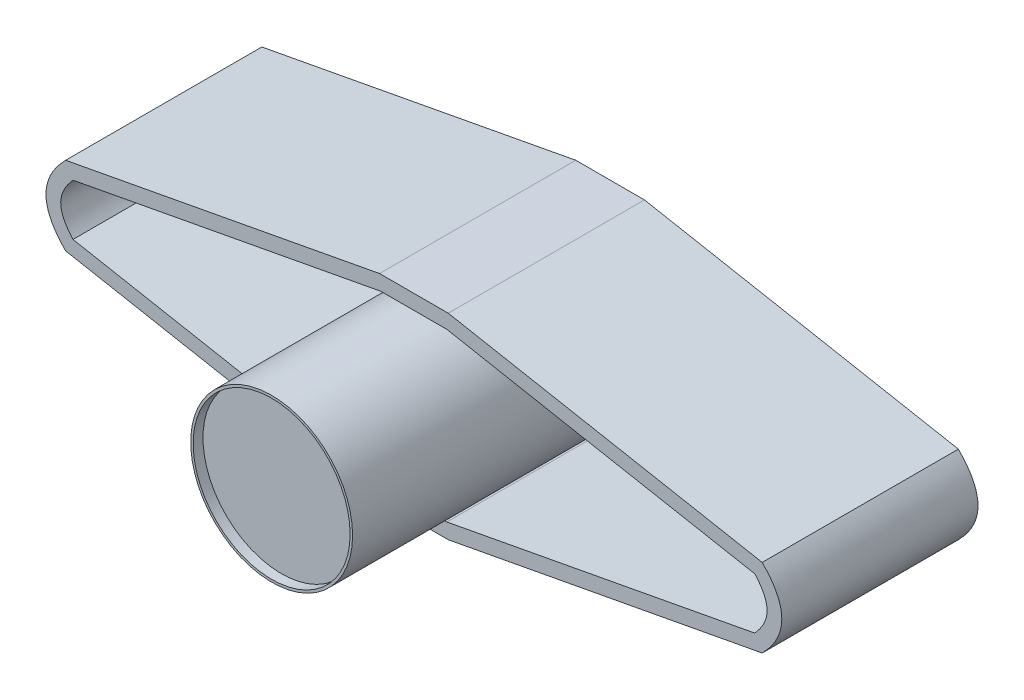
ISO-10303-21;
HEADER;
FILE_DESCRIPTION(('STEP AP214'),'2;1');
FILE_NAME('part.step','',(''),(''),'','','');
FILE_SCHEMA(('AUTOMOTIVE_DESIGN { 1 0 10303 214 1 1 1 1 }'));
ENDSEC;
DATA;
#1=APPLICATION_CONTEXT('core data for automotive mechanical design processes');
#2=APPLICATION_PROTOCOL_DEFINITION('international standard','automotive_design',2000,#1);
#3=PRODUCT_CONTEXT('',#1,'mechanical');
#4=PRODUCT('Part','Part','',(#3));
#5=PRODUCT_RELATED_PRODUCT_CATEGORY('part','',(#4));
#6=PRODUCT_DEFINITION_FORMATION('','',#4);
#7=PRODUCT_DEFINITION_CONTEXT('part definition',#1,'design');
#8=PRODUCT_DEFINITION('design','',#6,#7);
#9=PRODUCT_DEFINITION_SHAPE('','',#8);
#10=(LENGTH_UNIT() NAMED_UNIT(*) SI_UNIT(.MILLI.,.METRE.));
#11=(NAMED_UNIT(*) PLANE_ANGLE_UNIT() SI_UNIT($,.RADIAN.));
#12=(NAMED_UNIT(*) SI_UNIT($,.STERADIAN.) SOLID_ANGLE_UNIT());
#13=UNCERTAINTY_MEASURE_WITH_UNIT(LENGTH_MEASURE(1.E-05),#10,'distance_accuracy_value','');
#14=(GEOMETRIC_REPRESENTATION_CONTEXT(3) GLOBAL_UNCERTAINTY_ASSIGNED_CONTEXT((#13)) GLOBAL_UNIT_ASSIGNED_CONTEXT((#10,
#11,#12)) REPRESENTATION_CONTEXT('',''));
#15=CARTESIAN_POINT('',(0.,0.,0.));
#16=DIRECTION('',(0.,0.,1.));
#17=DIRECTION('',(1.,0.,0.));
#18=AXIS2_PLACEMENT_3D('',#15,#16,#17);
#19=CARTESIAN_POINT('',(37.5,0.,1.5));
#20=DIRECTION('',(0.,0.,1.));
#21=DIRECTION('',(1.,0.,0.));
#22=AXIS2_PLACEMENT_3D('',#19,#20,#21);
#23=PLANE('',#22);
#24=DIRECTION('',(-0.982872186934322,0.184288535050185,0.));
#25=VECTOR('',#24,1.);
#26=CARTESIAN_POINT('',(3.22356719742472,8.5256917195985,1.5));
#27=LINE('',#26,#25);
#28=CARTESIAN_POINT('',(34.7486412391802,2.61474033676936,1.5));
#29=VERTEX_POINT('',#28);
#30=CARTESIAN_POINT('',(3.36058970195014,8.49999999999998,1.5));
#31=VERTEX_POINT('',#30);
#32=EDGE_CURVE('E332',#29,#31,#27,.T.);
#33=ORIENTED_EDGE('',*,*,#32,.T.);
#34=DIRECTION('',(-1.,0.,0.));
#35=VECTOR('',#34,1.);
#36=CARTESIAN_POINT('',(-3.50000000000004,8.49999999999999,1.5));
#37=LINE('',#36,#35);
#38=CARTESIAN_POINT('',(-3.36058970195018,8.49999999999999,1.5));
#39=VERTEX_POINT('',#38);
#40=EDGE_CURVE('E337',#31,#39,#37,.T.);
#41=ORIENTED_EDGE('',*,*,#40,.T.);
#42=DIRECTION('',(-0.982872186934322,-0.184288535050186,0.));
#43=VECTOR('',#42,1.);
#44=CARTESIAN_POINT('',(-35.2235671974247,2.52569171959851,1.5));
#45=LINE('',#44,#43);
#46=CARTESIAN_POINT('',(-34.7486412391802,2.61474033676935,1.49999999999999));
#47=VERTEX_POINT('',#46);
#48=EDGE_CURVE('E252',#39,#47,#45,.T.);
#49=ORIENTED_EDGE('',*,*,#48,.T.);
#50=CARTESIAN_POINT('',(-34.7486412391802,2.61474033676935,1.49999999999999));
#51=CARTESIAN_POINT('',(-34.7950174983852,2.56351314613704,1.5));
#52=CARTESIAN_POINT('',(-34.8407582933629,2.51171268831779,1.5));
#53=CARTESIAN_POINT('',(-34.9308312398408,2.40688205072306,1.5));
#54=CARTESIAN_POINT('',(-34.9751630747801,2.3538515991615,1.5));
#55=CARTESIAN_POINT('',(-35.1061415257373,2.19241374118695,1.5));
#56=CARTESIAN_POINT('',(-35.190413299274,2.08205135177791,1.5));
#57=CARTESIAN_POINT('',(-35.3530544112961,1.85270176452829,1.5));
#58=CARTESIAN_POINT('',(-35.431214595681,1.73356528703449,1.5));
#59=CARTESIAN_POINT('',(-35.5766147401056,1.48894273163812,1.5));
#60=CARTESIAN_POINT('',(-35.6438728337023,1.36346766249547,1.5));
#61=CARTESIAN_POINT('',(-35.7377874299892,1.16256415127028,1.5));
#62=CARTESIAN_POINT('',(-35.7692917481388,1.089393251252,1.5));
#63=CARTESIAN_POINT('',(-35.827167678675,0.941024481870083,1.5));
#64=CARTESIAN_POINT('',(-35.8535391099393,0.865826541085518,1.5));
#65=CARTESIAN_POINT('',(-35.900207843212,0.714162170634662,1.5));
#66=CARTESIAN_POINT('',(-35.9205486463062,0.6377092442129,1.5));
#67=CARTESIAN_POINT('',(-35.9546714258785,0.483357497418734,1.5));
#68=CARTESIAN_POINT('',(-35.9684551268122,0.405459062806873,1.5));
#69=CARTESIAN_POINT('',(-35.9889855240001,0.24773816212583,1.5));
#70=CARTESIAN_POINT('',(-35.9956423107017,0.167903816698798,1.5));
#71=CARTESIAN_POINT('',(-36.0012652686574,0.00796527870703865,1.5));
#72=CARTESIAN_POINT('',(-36.0002318359698,-0.0721388997484829,1.5));
#73=CARTESIAN_POINT('',(-35.990522359588,-0.232014366841406,1.5));
#74=CARTESIAN_POINT('',(-35.9818332475168,-0.311784851803275,1.5));
#75=CARTESIAN_POINT('',(-35.9572351643645,-0.470200677119246,1.5));
#76=CARTESIAN_POINT('',(-35.9413248967947,-0.548845812811113,1.5));
#77=CARTESIAN_POINT('',(-35.8988676062231,-0.721170752785971,1.5));
#78=CARTESIAN_POINT('',(-35.8707732855371,-0.814468003573934,1.5));
#79=CARTESIAN_POINT('',(-35.8063433983286,-0.998214941186488,1.5));
#80=CARTESIAN_POINT('',(-35.7700007118471,-1.08866209054235,1.5));
#81=CARTESIAN_POINT('',(-35.6902244294107,-1.26689899664259,1.5));
#82=CARTESIAN_POINT('',(-35.6467555494306,-1.35467281316576,1.5));
#83=CARTESIAN_POINT('',(-35.5540420905331,-1.52705145521578,1.5));
#84=CARTESIAN_POINT('',(-35.5047994521351,-1.61165733292316,1.5));
#85=CARTESIAN_POINT('',(-35.4016853498958,-1.77752207432724,1.5));
#86=CARTESIAN_POINT('',(-35.3478327560003,-1.85879274124538,1.5));
#87=CARTESIAN_POINT('',(-35.2360856267194,-2.0185137067871,1.5));
#88=CARTESIAN_POINT('',(-35.1781904037369,-2.09696352216715,1.5));
#89=CARTESIAN_POINT('',(-35.0599131060224,-2.25000979102648,1.5));
#90=CARTESIAN_POINT('',(-34.9995837893129,-2.3246472239829,1.5));
#91=CARTESIAN_POINT('',(-34.876114901334,-2.47147208915409,1.5));
#92=CARTESIAN_POINT('',(-34.8129773936544,-2.54366125389805,1.5));
#93=CARTESIAN_POINT('',(-34.7486412391802,-2.61474033676937,1.5));
#94=B_SPLINE_CURVE_WITH_KNOTS('',3,(#50,#51,#52,#53,#54,#55,#56,#57,#58,#59,#60,#61,#62,#63,#64,
#65,#66,#67,#68,#69,#70,#71,#72,#73,#74,#75,#76,#77,#78,#79,#80,#81,#82,#83,#84,#85,#86,#87,#88,
#89,#90,#91,#92,#93),.UNSPECIFIED.,.F.,.F.,(4,2,2,2,2,2,2,2,2,2,2,2,2,2,2,2,2,2,2,2,2,4),(0.,
0.207293054903786,0.414632359190523,0.83089986991877,1.25793859955193,1.68425957637787,
1.92309763609224,2.16194412207457,2.39902328572455,2.63604006528808,2.87601291699062,
3.11597340979997,3.35634431465275,3.59675839286436,3.88859964796792,4.18069378399465,
4.47428045418183,4.76776873328752,5.06010839551896,5.35249790250261,5.64033473466003,
5.92796343696901),.UNSPECIFIED.);
#95=CARTESIAN_POINT('',(-34.7486412391802,-2.61474033676937,1.5));
#96=VERTEX_POINT('',#95);
#97=EDGE_CURVE('E244',#47,#96,#94,.T.);
#98=ORIENTED_EDGE('',*,*,#97,.T.);
#99=DIRECTION('',(0.982872186934322,-0.184288535050185,0.));
#100=VECTOR('',#99,1.);
#101=CARTESIAN_POINT('',(-3.22356719742476,-8.52569171959852,1.5));
#102=LINE('',#101,#100);
#103=CARTESIAN_POINT('',(-3.36058970195018,-8.5,1.5));
#104=VERTEX_POINT('',#103);
#105=EDGE_CURVE('E251',#96,#104,#102,.T.);
#106=ORIENTED_EDGE('',*,*,#105,.T.);
#107=DIRECTION('',(1.,0.,0.));
#108=VECTOR('',#107,1.);
#109=CARTESIAN_POINT('',(3.5,-8.5,1.5));
#110=LINE('',#109,#108);
#111=CARTESIAN_POINT('',(3.36058970195014,-8.5,1.5));
#112=VERTEX_POINT('',#111);
#113=EDGE_CURVE('E261',#104,#112,#110,.T.);
#114=ORIENTED_EDGE('',*,*,#113,.T.);
#115=DIRECTION('',(0.982872186934322,0.184288535050185,0.));
#116=VECTOR('',#115,1.);
#117=CARTESIAN_POINT('',(35.2235671974247,-2.52569171959852,1.5));
#118=LINE('',#117,#116);
#119=CARTESIAN_POINT('',(34.7486412391802,-2.61474033676935,1.5));
#120=VERTEX_POINT('',#119);
#121=EDGE_CURVE('E267',#112,#120,#118,.T.);
#122=ORIENTED_EDGE('',*,*,#121,.T.);
#123=CARTESIAN_POINT('',(34.7486412391802,-2.61474033676935,1.5));
#124=CARTESIAN_POINT('',(34.7950174983851,-2.56351314613703,1.5));
#125=CARTESIAN_POINT('',(34.8407582933629,-2.51171268831779,1.5));
#126=CARTESIAN_POINT('',(34.9308312398408,-2.40688205072306,1.5));
#127=CARTESIAN_POINT('',(34.9751630747801,-2.35385159916151,1.5));
#128=CARTESIAN_POINT('',(35.1061415257373,-2.19241374118696,1.5));
#129=CARTESIAN_POINT('',(35.1904132992739,-2.08205135177792,1.5));
#130=CARTESIAN_POINT('',(35.3530544112961,-1.8527017645283,1.5));
#131=CARTESIAN_POINT('',(35.431214595681,-1.7335652870345,1.5));
#132=CARTESIAN_POINT('',(35.5766147401056,-1.48894273163813,1.5));
#133=CARTESIAN_POINT('',(35.6438728337023,-1.36346766249549,1.5));
#134=CARTESIAN_POINT('',(35.7377874299892,-1.1625641512703,1.5));
#135=CARTESIAN_POINT('',(35.7692917481387,-1.08939325125202,1.5));
#136=CARTESIAN_POINT('',(35.827167678675,-0.941024481870106,1.5));
#137=CARTESIAN_POINT('',(35.8535391099393,-0.86582654108554,1.5));
#138=CARTESIAN_POINT('',(35.900207843212,-0.714162170634686,1.5));
#139=CARTESIAN_POINT('',(35.9205486463062,-0.637709244212928,1.5));
#140=CARTESIAN_POINT('',(35.9546714258785,-0.483357497418766,1.5));
#141=CARTESIAN_POINT('',(35.9684551268122,-0.405459062806904,1.5));
#142=CARTESIAN_POINT('',(35.9889855240001,-0.247738162125862,1.5));
#143=CARTESIAN_POINT('',(35.9956423107017,-0.167903816698831,1.5));
#144=CARTESIAN_POINT('',(36.0012652686574,-0.007965278707072,1.5));
#145=CARTESIAN_POINT('',(36.0002318359698,0.0721388997484496,1.5));
#146=CARTESIAN_POINT('',(35.990522359588,0.232014366841372,1.5));
#147=CARTESIAN_POINT('',(35.9818332475168,0.311784851803241,1.5));
#148=CARTESIAN_POINT('',(35.9572351643645,0.470200677119212,1.5));
#149=CARTESIAN_POINT('',(35.9413248967947,0.54884581281108,1.5));
#150=CARTESIAN_POINT('',(35.8988676062231,0.721170752785934,1.5));
#151=CARTESIAN_POINT('',(35.8707732855371,0.814468003573892,1.5));
#152=CARTESIAN_POINT('',(35.8063433983286,0.998214941186438,1.5));
#153=CARTESIAN_POINT('',(35.7700007118472,1.0886620905423,1.5));
#154=CARTESIAN_POINT('',(35.6902244294107,1.26689899664253,1.5));
#155=CARTESIAN_POINT('',(35.6467555494306,1.3546728131657,1.5));
#156=CARTESIAN_POINT('',(35.5540420905331,1.52705145521571,1.5));
#157=CARTESIAN_POINT('',(35.5047994521351,1.61165733292308,1.5));
#158=CARTESIAN_POINT('',(35.4016853498958,1.77752207432718,1.5));
#159=CARTESIAN_POINT('',(35.3478327560004,1.85879274124533,1.5));
#160=CARTESIAN_POINT('',(35.2360856267194,2.01851370678706,1.5));
#161=CARTESIAN_POINT('',(35.1781904037369,2.09696352216711,1.5));
#162=CARTESIAN_POINT('',(35.0599131060224,2.25000979102644,1.5));
#163=CARTESIAN_POINT('',(34.9995837893129,2.32464722398287,1.5));
#164=CARTESIAN_POINT('',(34.876114901334,2.47147208915407,1.5));
#165=CARTESIAN_POINT('',(34.8129773936544,2.54366125389804,1.5));
#166=CARTESIAN_POINT('',(34.7486412391802,2.61474033676936,1.5));
#167=B_SPLINE_CURVE_WITH_KNOTS('',3,(#123,#124,#125,#126,#127,#128,#129,#130,#131,#132,#133,
#134,#135,#136,#137,#138,#139,#140,#141,#142,#143,#144,#145,#146,#147,#148,#149,#150,#151,#152,
#153,#154,#155,#156,#157,#158,#159,#160,#161,#162,#163,#164,#165,#166),.UNSPECIFIED.,.F.,.F.,(4,
2,2,2,2,2,2,2,2,2,2,2,2,2,2,2,2,2,2,2,2,4),(0.,0.207293054903788,0.414632359190527,
0.830899869918768,1.25793859955192,1.68425957637786,1.92309763609223,2.16194412207455,
2.39902328572454,2.63604006528806,2.8760129169906,3.11597340979994,3.35634431465272,
3.59675839286434,3.88859964796789,4.18069378399461,4.47428045418177,4.76776873328745,
5.06010839551892,5.35249790250258,5.64033473466001,5.92796343696901),.UNSPECIFIED.);
#168=EDGE_CURVE('E272',#120,#29,#167,.T.);
#169=ORIENTED_EDGE('',*,*,#168,.T.);
#170=EDGE_LOOP('',(#33,#41,#49,#98,#106,#114,#122,#169));
#171=FACE_BOUND('',#170,.T.);
#172=CARTESIAN_POINT('',(0.,0.,1.5));
#173=DIRECTION('',(0.,0.,1.));
#174=DIRECTION('',(1.,0.,0.));
#175=AXIS2_PLACEMENT_3D('',#172,#173,#174);
#176=CIRCLE('',#175,8.25);
#177=CARTESIAN_POINT('',(8.25,0.,1.5));
#178=VERTEX_POINT('',#177);
#179=EDGE_CURVE('E600',#178,#178,#176,.T.);
#180=ORIENTED_EDGE('',*,*,#179,.F.);
#181=EDGE_LOOP('',(#180));
#182=FACE_BOUND('',#181,.T.);
#183=ADVANCED_FACE('F32',(#171,#182),#23,.T.);
#184=CARTESIAN_POINT('',(3.5,9.99999999999998,20.));
#185=DIRECTION('',(-0.184288535050185,-0.982872186934322,0.));
#186=DIRECTION('',(0.982872186934322,-0.184288535050185,0.));
#187=AXIS2_PLACEMENT_3D('',#184,#185,#186);
#188=PLANE('',#187);
#189=DIRECTION('',(-0.982872186934322,0.184288535050185,0.));
#190=VECTOR('',#189,1.);
#191=CARTESIAN_POINT('',(3.5,9.99999999999998,0.));
#192=LINE('',#191,#190);
#193=CARTESIAN_POINT('',(35.5,3.99999999999999,0.));
#194=VERTEX_POINT('',#193);
#195=CARTESIAN_POINT('',(3.5,9.99999999999998,0.));
#196=VERTEX_POINT('',#195);
#197=EDGE_CURVE('E140',#194,#196,#192,.T.);
#198=ORIENTED_EDGE('',*,*,#197,.T.);
#199=DIRECTION('',(0.,0.,-1.));
#200=VECTOR('',#199,1.);
#201=CARTESIAN_POINT('',(3.5,9.99999999999998,20.));
#202=LINE('',#201,#200);
#203=CARTESIAN_POINT('',(3.5,9.99999999999998,20.));
#204=VERTEX_POINT('',#203);
#205=EDGE_CURVE('E11',#204,#196,#202,.T.);
#206=ORIENTED_EDGE('',*,*,#205,.F.);
#207=DIRECTION('',(-0.982872186934322,0.184288535050185,0.));
#208=VECTOR('',#207,1.);
#209=CARTESIAN_POINT('',(3.5,9.99999999999998,20.));
#210=LINE('',#209,#208);
#211=CARTESIAN_POINT('',(35.5,3.99999999999999,20.));
#212=VERTEX_POINT('',#211);
#213=EDGE_CURVE('E163',#212,#204,#210,.T.);
#214=ORIENTED_EDGE('',*,*,#213,.F.);
#215=DIRECTION('',(0.,0.,-1.));
#216=VECTOR('',#215,1.);
#217=CARTESIAN_POINT('',(35.5,3.99999999999999,20.));
#218=LINE('',#217,#216);
#219=EDGE_CURVE('E136',#212,#194,#218,.T.);
#220=ORIENTED_EDGE('',*,*,#219,.T.);
#221=EDGE_LOOP('',(#198,#206,#214,#220));
#222=FACE_BOUND('',#221,.T.);
#223=ADVANCED_FACE('F34',(#222),#188,.F.);
#224=CARTESIAN_POINT('',(-3.50000000000004,9.99999999999999,20.));
#225=DIRECTION('',(0.,-1.,0.));
#226=DIRECTION('',(1.,0.,0.));
#227=AXIS2_PLACEMENT_3D('',#224,#225,#226);
#228=PLANE('',#227);
#229=DIRECTION('',(-1.,0.,0.));
#230=VECTOR('',#229,1.);
#231=CARTESIAN_POINT('',(-3.50000000000004,9.99999999999999,0.));
#232=LINE('',#231,#230);
#233=CARTESIAN_POINT('',(-3.50000000000004,9.99999999999999,0.));
#234=VERTEX_POINT('',#233);
#235=EDGE_CURVE('E143',#196,#234,#232,.T.);
#236=ORIENTED_EDGE('',*,*,#235,.T.);
#237=DIRECTION('',(0.,0.,-1.));
#238=VECTOR('',#237,1.);
#239=CARTESIAN_POINT('',(-3.50000000000004,9.99999999999999,20.));
#240=LINE('',#239,#238);
#241=CARTESIAN_POINT('',(-3.50000000000004,9.99999999999999,20.));
#242=VERTEX_POINT('',#241);
#243=EDGE_CURVE('E40',#242,#234,#240,.T.);
#244=ORIENTED_EDGE('',*,*,#243,.F.);
#245=DIRECTION('',(-1.,0.,0.));
#246=VECTOR('',#245,1.);
#247=CARTESIAN_POINT('',(-3.50000000000004,9.99999999999999,20.));
#248=LINE('',#247,#246);
#249=EDGE_CURVE('E97',#204,#242,#248,.T.);
#250=ORIENTED_EDGE('',*,*,#249,.F.);
#251=ORIENTED_EDGE('',*,*,#205,.T.);
#252=EDGE_LOOP('',(#236,#244,#250,#251));
#253=FACE_BOUND('',#252,.T.);
#254=ADVANCED_FACE('F375',(#253),#228,.F.);
#255=CARTESIAN_POINT('',(-35.5,3.99999999999999,20.));
#256=DIRECTION('',(0.184288535050186,-0.982872186934322,0.));
#257=DIRECTION('',(0.982872186934322,0.184288535050186,0.));
#258=AXIS2_PLACEMENT_3D('',#255,#256,#257);
#259=PLANE('',#258);
#260=DIRECTION('',(-0.982872186934322,-0.184288535050186,0.));
#261=VECTOR('',#260,1.);
#262=CARTESIAN_POINT('',(-35.5,3.99999999999999,0.));
#263=LINE('',#262,#261);
#264=CARTESIAN_POINT('',(-35.5,3.99999999999999,0.));
#265=VERTEX_POINT('',#264);
#266=EDGE_CURVE('E146',#234,#265,#263,.T.);
#267=ORIENTED_EDGE('',*,*,#266,.T.);
#268=DIRECTION('',(0.,0.,-1.));
#269=VECTOR('',#268,1.);
#270=CARTESIAN_POINT('',(-35.5,3.99999999999999,20.));
#271=LINE('',#270,#269);
#272=CARTESIAN_POINT('',(-35.5,3.99999999999999,20.));
#273=VERTEX_POINT('',#272);
#274=EDGE_CURVE('E173',#273,#265,#271,.T.);
#275=ORIENTED_EDGE('',*,*,#274,.F.);
#276=DIRECTION('',(-0.982872186934322,-0.184288535050186,0.));
#277=VECTOR('',#276,1.);
#278=CARTESIAN_POINT('',(-35.5,3.99999999999999,20.));
#279=LINE('',#278,#277);
#280=EDGE_CURVE('E181',#242,#273,#279,.T.);
#281=ORIENTED_EDGE('',*,*,#280,.F.);
#282=ORIENTED_EDGE('',*,*,#243,.T.);
#283=EDGE_LOOP('',(#267,#275,#281,#282));
#284=FACE_BOUND('',#283,.T.);
#285=ADVANCED_FACE('F179',(#284),#259,.F.);
#286=CARTESIAN_POINT('',(-35.5,3.99999999999999,20.));
#287=CARTESIAN_POINT('',(-39.5,0.,20.));
#288=CARTESIAN_POINT('',(-35.5,-4.,20.));
#289=B_SPLINE_CURVE_WITH_KNOTS('',2,(#286,#287,#288),.UNSPECIFIED.,.F.,.F.,(3,3),(0.,1.),.UNSPECIFIED.);
#290=DIRECTION('',(0.,0.,-1.));
#291=VECTOR('',#290,1.);
#292=SURFACE_OF_LINEAR_EXTRUSION('',#289,#291);
#293=CARTESIAN_POINT('',(-35.5,3.99999999999999,0.));
#294=CARTESIAN_POINT('',(-39.5,0.,0.));
#295=CARTESIAN_POINT('',(-35.5,-4.,0.));
#296=B_SPLINE_CURVE_WITH_KNOTS('',2,(#293,#294,#295),.UNSPECIFIED.,.F.,.F.,(3,3),(0.,1.),.UNSPECIFIED.);
#297=CARTESIAN_POINT('',(-35.5,-4.,0.));
#298=VERTEX_POINT('',#297);
#299=EDGE_CURVE('E148',#265,#298,#296,.T.);
#300=ORIENTED_EDGE('',*,*,#299,.T.);
#301=DIRECTION('',(0.,0.,-1.));
#302=VECTOR('',#301,1.);
#303=CARTESIAN_POINT('',(-35.5,-4.,20.));
#304=LINE('',#303,#302);
#305=CARTESIAN_POINT('',(-35.5,-4.,20.));
#306=VERTEX_POINT('',#305);
#307=EDGE_CURVE('E170',#306,#298,#304,.T.);
#308=ORIENTED_EDGE('',*,*,#307,.F.);
#309=EDGE_CURVE('E193',#273,#306,#289,.T.);
#310=ORIENTED_EDGE('',*,*,#309,.F.);
#311=ORIENTED_EDGE('',*,*,#274,.T.);
#312=EDGE_LOOP('',(#300,#308,#310,#311));
#313=FACE_BOUND('',#312,.T.);
#314=ADVANCED_FACE('F189',(#313),#292,.F.);
#315=CARTESIAN_POINT('',(-3.50000000000004,-10.,20.));
#316=DIRECTION('',(0.184288535050185,0.982872186934322,0.));
#317=DIRECTION('',(-0.982872186934322,0.184288535050185,0.));
#318=AXIS2_PLACEMENT_3D('',#315,#316,#317);
#319=PLANE('',#318);
#320=DIRECTION('',(0.982872186934322,-0.184288535050185,0.));
#321=VECTOR('',#320,1.);
#322=CARTESIAN_POINT('',(-3.50000000000004,-10.,0.));
#323=LINE('',#322,#321);
#324=CARTESIAN_POINT('',(-3.50000000000004,-10.,0.));
#325=VERTEX_POINT('',#324);
#326=EDGE_CURVE('E152',#298,#325,#323,.T.);
#327=ORIENTED_EDGE('',*,*,#326,.T.);
#328=DIRECTION('',(0.,0.,-1.));
#329=VECTOR('',#328,1.);
#330=CARTESIAN_POINT('',(-3.50000000000004,-10.,20.));
#331=LINE('',#330,#329);
#332=CARTESIAN_POINT('',(-3.50000000000004,-10.,20.));
#333=VERTEX_POINT('',#332);
#334=EDGE_CURVE('E131',#333,#325,#331,.T.);
#335=ORIENTED_EDGE('',*,*,#334,.F.);
#336=DIRECTION('',(0.982872186934322,-0.184288535050185,0.));
#337=VECTOR('',#336,1.);
#338=CARTESIAN_POINT('',(-3.50000000000004,-10.,20.));
#339=LINE('',#338,#337);
#340=EDGE_CURVE('E119',#306,#333,#339,.T.);
#341=ORIENTED_EDGE('',*,*,#340,.F.);
#342=ORIENTED_EDGE('',*,*,#307,.T.);
#343=EDGE_LOOP('',(#327,#335,#341,#342));
#344=FACE_BOUND('',#343,.T.);
#345=ADVANCED_FACE('F192',(#344),#319,.F.);
#346=CARTESIAN_POINT('',(3.5,-10.,20.));
#347=DIRECTION('',(0.,1.,0.));
#348=DIRECTION('',(-1.,0.,0.));
#349=AXIS2_PLACEMENT_3D('',#346,#347,#348);
#350=PLANE('',#349);
#351=DIRECTION('',(1.,0.,0.));
#352=VECTOR('',#351,1.);
#353=CARTESIAN_POINT('',(3.5,-10.,0.));
#354=LINE('',#353,#352);
#355=CARTESIAN_POINT('',(3.5,-10.,0.));
#356=VERTEX_POINT('',#355);
#357=EDGE_CURVE('E128',#325,#356,#354,.T.);
#358=ORIENTED_EDGE('',*,*,#357,.T.);
#359=DIRECTION('',(0.,0.,-1.));
#360=VECTOR('',#359,1.);
#361=CARTESIAN_POINT('',(3.5,-10.,20.));
#362=LINE('',#361,#360);
#363=CARTESIAN_POINT('',(3.5,-10.,20.));
#364=VERTEX_POINT('',#363);
#365=EDGE_CURVE('E125',#364,#356,#362,.T.);
#366=ORIENTED_EDGE('',*,*,#365,.F.);
#367=DIRECTION('',(1.,0.,0.));
#368=VECTOR('',#367,1.);
#369=CARTESIAN_POINT('',(3.5,-10.,20.));
#370=LINE('',#369,#368);
#371=EDGE_CURVE('E112',#333,#364,#370,.T.);
#372=ORIENTED_EDGE('',*,*,#371,.F.);
#373=ORIENTED_EDGE('',*,*,#334,.T.);
#374=EDGE_LOOP('',(#358,#366,#372,#373));
#375=FACE_BOUND('',#374,.T.);
#376=ADVANCED_FACE('F126',(#375),#350,.F.);
#377=CARTESIAN_POINT('',(35.5,-4.,20.));
#378=DIRECTION('',(-0.184288535050185,0.982872186934322,0.));
#379=DIRECTION('',(-0.982872186934322,-0.184288535050185,0.));
#380=AXIS2_PLACEMENT_3D('',#377,#378,#379);
#381=PLANE('',#380);
#382=DIRECTION('',(0.982872186934322,0.184288535050185,0.));
#383=VECTOR('',#382,1.);
#384=CARTESIAN_POINT('',(35.5,-4.,0.));
#385=LINE('',#384,#383);
#386=CARTESIAN_POINT('',(35.5,-4.,0.));
#387=VERTEX_POINT('',#386);
#388=EDGE_CURVE('E158',#356,#387,#385,.T.);
#389=ORIENTED_EDGE('',*,*,#388,.T.);
#390=DIRECTION('',(0.,0.,-1.));
#391=VECTOR('',#390,1.);
#392=CARTESIAN_POINT('',(35.5,-4.,20.));
#393=LINE('',#392,#391);
#394=CARTESIAN_POINT('',(35.5,-4.,20.));
#395=VERTEX_POINT('',#394);
#396=EDGE_CURVE('E132',#395,#387,#393,.T.);
#397=ORIENTED_EDGE('',*,*,#396,.F.);
#398=DIRECTION('',(0.982872186934322,0.184288535050185,0.));
#399=VECTOR('',#398,1.);
#400=CARTESIAN_POINT('',(35.5,-4.,20.));
#401=LINE('',#400,#399);
#402=EDGE_CURVE('E116',#364,#395,#401,.T.);
#403=ORIENTED_EDGE('',*,*,#402,.F.);
#404=ORIENTED_EDGE('',*,*,#365,.T.);
#405=EDGE_LOOP('',(#389,#397,#403,#404));
#406=FACE_BOUND('',#405,.T.);
#407=ADVANCED_FACE('F134',(#406),#381,.F.);
#408=CARTESIAN_POINT('',(35.5,-3.99999999999999,20.));
#409=CARTESIAN_POINT('',(39.5,0.,20.));
#410=CARTESIAN_POINT('',(35.5,3.99999999999999,20.));
#411=B_SPLINE_CURVE_WITH_KNOTS('',2,(#408,#409,#410),.UNSPECIFIED.,.F.,.F.,(3,3),(0.,1.),.UNSPECIFIED.);
#412=DIRECTION('',(0.,0.,-1.));
#413=VECTOR('',#412,1.);
#414=SURFACE_OF_LINEAR_EXTRUSION('',#411,#413);
#415=CARTESIAN_POINT('',(35.5,-3.99999999999999,0.));
#416=CARTESIAN_POINT('',(39.5,0.,0.));
#417=CARTESIAN_POINT('',(35.5,3.99999999999999,0.));
#418=B_SPLINE_CURVE_WITH_KNOTS('',2,(#415,#416,#417),.UNSPECIFIED.,.F.,.F.,(3,3),(0.,1.),.UNSPECIFIED.);
#419=EDGE_CURVE('E89',#387,#194,#418,.T.);
#420=ORIENTED_EDGE('',*,*,#419,.T.);
#421=ORIENTED_EDGE('',*,*,#219,.F.);
#422=EDGE_CURVE('E56',#395,#212,#411,.T.);
#423=ORIENTED_EDGE('',*,*,#422,.F.);
#424=ORIENTED_EDGE('',*,*,#396,.T.);
#425=EDGE_LOOP('',(#420,#421,#423,#424));
#426=FACE_BOUND('',#425,.T.);
#427=ADVANCED_FACE('F218',(#426),#414,.F.);
#428=CARTESIAN_POINT('',(37.5,0.,20.));
#429=DIRECTION('',(0.,0.,1.));
#430=DIRECTION('',(1.,0.,0.));
#431=AXIS2_PLACEMENT_3D('',#428,#429,#430);
#432=PLANE('',#431);
#433=DIRECTION('',(-0.982872186934322,0.184288535050185,0.));
#434=VECTOR('',#433,1.);
#435=CARTESIAN_POINT('',(3.22356719742472,8.5256917195985,20.));
#436=LINE('',#435,#434);
#437=CARTESIAN_POINT('',(34.7486412391802,2.61474033676936,20.));
#438=VERTEX_POINT('',#437);
#439=CARTESIAN_POINT('',(3.36058970195014,8.49999999999998,20.));
#440=VERTEX_POINT('',#439);
#441=EDGE_CURVE('E279',#438,#440,#436,.T.);
#442=ORIENTED_EDGE('',*,*,#441,.F.);
#443=CARTESIAN_POINT('',(34.7486412391802,-2.61474033676936,20.));
#444=CARTESIAN_POINT('',(34.7950174983851,-2.56351314613704,20.));
#445=CARTESIAN_POINT('',(34.8407582933629,-2.51171268831779,20.));
#446=CARTESIAN_POINT('',(34.9308312398408,-2.40688205072307,20.));
#447=CARTESIAN_POINT('',(34.9751630747801,-2.35385159916151,20.));
#448=CARTESIAN_POINT('',(35.1061415257373,-2.19241374118696,20.));
#449=CARTESIAN_POINT('',(35.190413299274,-2.08205135177793,20.));
#450=CARTESIAN_POINT('',(35.3530544112961,-1.8527017645283,20.));
#451=CARTESIAN_POINT('',(35.431214595681,-1.73356528703449,20.));
#452=CARTESIAN_POINT('',(35.5766147401056,-1.48894273163812,20.));
#453=CARTESIAN_POINT('',(35.6438728337023,-1.36346766249548,20.));
#454=CARTESIAN_POINT('',(35.7377874299892,-1.16256415127029,20.));
#455=CARTESIAN_POINT('',(35.7692917481388,-1.08939325125202,20.));
#456=CARTESIAN_POINT('',(35.827167678675,-0.9410244818701,20.));
#457=CARTESIAN_POINT('',(35.8535391099393,-0.865826541085534,20.));
#458=CARTESIAN_POINT('',(35.900207843212,-0.714162170634681,20.));
#459=CARTESIAN_POINT('',(35.9205486463062,-0.637709244212922,20.));
#460=CARTESIAN_POINT('',(35.9546714258785,-0.483357497418761,20.));
#461=CARTESIAN_POINT('',(35.9684551268122,-0.405459062806901,20.));
#462=CARTESIAN_POINT('',(35.9889855240001,-0.247738162125861,20.));
#463=CARTESIAN_POINT('',(35.9956423107017,-0.16790381669883,20.));
#464=CARTESIAN_POINT('',(36.0012652686574,-0.00796527870707173,20.));
#465=CARTESIAN_POINT('',(36.0002318359698,0.0721388997484492,20.));
#466=CARTESIAN_POINT('',(35.990522359588,0.232014366841371,20.));
#467=CARTESIAN_POINT('',(35.9818332475168,0.311784851803241,20.));
#468=CARTESIAN_POINT('',(35.9572351643645,0.470200677119211,20.));
#469=CARTESIAN_POINT('',(35.9413248967947,0.548845812811078,20.));
#470=CARTESIAN_POINT('',(35.8988676062231,0.721170752785931,20.));
#471=CARTESIAN_POINT('',(35.8707732855371,0.81446800357389,20.));
#472=CARTESIAN_POINT('',(35.8063433983286,0.998214941186437,20.));
#473=CARTESIAN_POINT('',(35.7700007118472,1.08866209054229,20.));
#474=CARTESIAN_POINT('',(35.6902244294107,1.26689899664253,20.));
#475=CARTESIAN_POINT('',(35.6467555494306,1.35467281316569,20.));
#476=CARTESIAN_POINT('',(35.5540420905331,1.5270514552157,20.));
#477=CARTESIAN_POINT('',(35.5047994521351,1.61165733292308,20.));
#478=CARTESIAN_POINT('',(35.4016853498958,1.77752207432718,20.));
#479=CARTESIAN_POINT('',(35.3478327560004,1.85879274124532,20.));
#480=CARTESIAN_POINT('',(35.2360856267195,2.01851370678705,20.));
#481=CARTESIAN_POINT('',(35.1781904037369,2.0969635221671,20.));
#482=CARTESIAN_POINT('',(35.0599131060224,2.25000979102644,20.));
#483=CARTESIAN_POINT('',(34.9995837893129,2.32464722398287,20.));
#484=CARTESIAN_POINT('',(34.876114901334,2.47147208915407,20.));
#485=CARTESIAN_POINT('',(34.8129773936544,2.54366125389803,20.));
#486=CARTESIAN_POINT('',(34.7486412391802,2.61474033676936,20.));
#487=B_SPLINE_CURVE_WITH_KNOTS('',3,(#443,#444,#445,#446,#447,#448,#449,#450,#451,#452,#453,
#454,#455,#456,#457,#458,#459,#460,#461,#462,#463,#464,#465,#466,#467,#468,#469,#470,#471,#472,
#473,#474,#475,#476,#477,#478,#479,#480,#481,#482,#483,#484,#485,#486),.UNSPECIFIED.,.F.,.F.,(4,
2,2,2,2,2,2,2,2,2,2,2,2,2,2,2,2,2,2,2,2,4),(0.,0.207293054903786,0.41463235919053,
0.830899869918776,1.25793859955193,1.68425957637787,1.92309763609224,2.16194412207456,
2.39902328572454,2.63604006528807,2.87601291699061,3.11597340979995,3.35634431465273,
3.59675839286434,3.88859964796789,4.18069378399461,4.47428045418177,4.76776873328745,
5.06010839551891,5.35249790250258,5.64033473466002,5.92796343696902),.UNSPECIFIED.);
#488=CARTESIAN_POINT('',(34.7486412391802,-2.61474033676936,20.));
#489=VERTEX_POINT('',#488);
#490=EDGE_CURVE('E199',#489,#438,#487,.T.);
#491=ORIENTED_EDGE('',*,*,#490,.F.);
#492=DIRECTION('',(0.982872186934322,0.184288535050185,0.));
#493=VECTOR('',#492,1.);
#494=CARTESIAN_POINT('',(35.2235671974247,-2.52569171959852,20.));
#495=LINE('',#494,#493);
#496=CARTESIAN_POINT('',(3.36058970195014,-8.5,20.));
#497=VERTEX_POINT('',#496);
#498=EDGE_CURVE('E207',#497,#489,#495,.T.);
#499=ORIENTED_EDGE('',*,*,#498,.F.);
#500=DIRECTION('',(1.,0.,0.));
#501=VECTOR('',#500,1.);
#502=CARTESIAN_POINT('',(3.5,-8.5,20.));
#503=LINE('',#502,#501);
#504=CARTESIAN_POINT('',(-3.36058970195018,-8.5,20.));
#505=VERTEX_POINT('',#504);
#506=EDGE_CURVE('E311',#505,#497,#503,.T.);
#507=ORIENTED_EDGE('',*,*,#506,.F.);
#508=DIRECTION('',(0.982872186934322,-0.184288535050185,0.));
#509=VECTOR('',#508,1.);
#510=CARTESIAN_POINT('',(-3.22356719742476,-8.52569171959852,20.));
#511=LINE('',#510,#509);
#512=CARTESIAN_POINT('',(-34.7486412391802,-2.61474033676937,20.));
#513=VERTEX_POINT('',#512);
#514=EDGE_CURVE('E231',#513,#505,#511,.T.);
#515=ORIENTED_EDGE('',*,*,#514,.F.);
#516=CARTESIAN_POINT('',(-34.7486412391802,2.61474033676935,20.));
#517=CARTESIAN_POINT('',(-34.7950174983852,2.56351314613704,20.));
#518=CARTESIAN_POINT('',(-34.8407582933629,2.51171268831779,20.));
#519=CARTESIAN_POINT('',(-34.9308312398408,2.40688205072306,20.));
#520=CARTESIAN_POINT('',(-34.9751630747801,2.3538515991615,20.));
#521=CARTESIAN_POINT('',(-35.1061415257373,2.19241374118695,20.));
#522=CARTESIAN_POINT('',(-35.190413299274,2.08205135177791,20.));
#523=CARTESIAN_POINT('',(-35.3530544112961,1.85270176452829,20.));
#524=CARTESIAN_POINT('',(-35.431214595681,1.73356528703449,20.));
#525=CARTESIAN_POINT('',(-35.5766147401056,1.48894273163811,20.));
#526=CARTESIAN_POINT('',(-35.6438728337023,1.36346766249547,20.));
#527=CARTESIAN_POINT('',(-35.7377874299892,1.16256415127027,20.));
#528=CARTESIAN_POINT('',(-35.7692917481388,1.089393251252,20.));
#529=CARTESIAN_POINT('',(-35.827167678675,0.941024481870079,20.));
#530=CARTESIAN_POINT('',(-35.8535391099393,0.865826541085512,20.));
#531=CARTESIAN_POINT('',(-35.900207843212,0.714162170634656,20.));
#532=CARTESIAN_POINT('',(-35.9205486463062,0.637709244212896,20.));
#533=CARTESIAN_POINT('',(-35.9546714258785,0.483357497418734,20.));
#534=CARTESIAN_POINT('',(-35.9684551268123,0.405459062806874,20.));
#535=CARTESIAN_POINT('',(-35.9889855240001,0.247738162125833,20.));
#536=CARTESIAN_POINT('',(-35.9956423107017,0.167903816698802,20.));
#537=CARTESIAN_POINT('',(-36.0012652686574,0.00796527870704306,20.));
#538=CARTESIAN_POINT('',(-36.0002318359698,-0.0721388997484782,20.));
#539=CARTESIAN_POINT('',(-35.990522359588,-0.2320143668414,20.));
#540=CARTESIAN_POINT('',(-35.9818332475168,-0.311784851803269,20.));
#541=CARTESIAN_POINT('',(-35.9572351643645,-0.47020067711924,20.));
#542=CARTESIAN_POINT('',(-35.9413248967947,-0.548845812811107,20.));
#543=CARTESIAN_POINT('',(-35.8988676062231,-0.721170752785961,20.));
#544=CARTESIAN_POINT('',(-35.8707732855371,-0.814468003573919,20.));
#545=CARTESIAN_POINT('',(-35.8063433983286,-0.99821494118647,20.));
#546=CARTESIAN_POINT('',(-35.7700007118472,-1.08866209054233,20.));
#547=CARTESIAN_POINT('',(-35.6902244294107,-1.26689899664258,20.));
#548=CARTESIAN_POINT('',(-35.6467555494306,-1.35467281316574,20.));
#549=CARTESIAN_POINT('',(-35.5540420905331,-1.52705145521576,20.));
#550=CARTESIAN_POINT('',(-35.5047994521351,-1.61165733292313,20.));
#551=CARTESIAN_POINT('',(-35.4016853498958,-1.77752207432723,20.));
#552=CARTESIAN_POINT('',(-35.3478327560004,-1.85879274124537,20.));
#553=CARTESIAN_POINT('',(-35.2360856267194,-2.01851370678709,20.));
#554=CARTESIAN_POINT('',(-35.1781904037369,-2.09696352216714,20.));
#555=CARTESIAN_POINT('',(-35.0599131060224,-2.25000979102647,20.));
#556=CARTESIAN_POINT('',(-34.9995837893129,-2.32464722398289,20.));
#557=CARTESIAN_POINT('',(-34.876114901334,-2.47147208915409,20.));
#558=CARTESIAN_POINT('',(-34.8129773936544,-2.54366125389805,20.));
#559=CARTESIAN_POINT('',(-34.7486412391802,-2.61474033676937,20.));
#560=B_SPLINE_CURVE_WITH_KNOTS('',3,(#516,#517,#518,#519,#520,#521,#522,#523,#524,#525,#526,
#527,#528,#529,#530,#531,#532,#533,#534,#535,#536,#537,#538,#539,#540,#541,#542,#543,#544,#545,
#546,#547,#548,#549,#550,#551,#552,#553,#554,#555,#556,#557,#558,#559),.UNSPECIFIED.,.F.,.F.,(4,
2,2,2,2,2,2,2,2,2,2,2,2,2,2,2,2,2,2,2,2,4),(0.,0.207293054903785,0.414632359190526,
0.830899869918773,1.25793859955193,1.68425957637787,1.92309763609225,2.16194412207457,
2.39902328572455,2.63604006528808,2.87601291699062,3.11597340979996,3.35634431465274,
3.59675839286435,3.8885996479679,4.18069378399463,4.4742804541818,4.76776873328749,
5.06010839551895,5.3524979025026,5.64033473466002,5.92796343696901),.UNSPECIFIED.);
#561=CARTESIAN_POINT('',(-34.7486412391802,2.61474033676935,20.));
#562=VERTEX_POINT('',#561);
#563=EDGE_CURVE('E223',#562,#513,#560,.T.);
#564=ORIENTED_EDGE('',*,*,#563,.F.);
#565=DIRECTION('',(-0.982872186934322,-0.184288535050186,0.));
#566=VECTOR('',#565,1.);
#567=CARTESIAN_POINT('',(-35.2235671974247,2.52569171959851,20.));
#568=LINE('',#567,#566);
#569=CARTESIAN_POINT('',(-3.36058970195018,8.49999999999999,20.));
#570=VERTEX_POINT('',#569);
#571=EDGE_CURVE('E232',#570,#562,#568,.T.);
#572=ORIENTED_EDGE('',*,*,#571,.F.);
#573=DIRECTION('',(-1.,0.,0.));
#574=VECTOR('',#573,1.);
#575=CARTESIAN_POINT('',(-3.50000000000004,8.49999999999999,20.));
#576=LINE('',#575,#574);
#577=EDGE_CURVE('E281',#440,#570,#576,.T.);
#578=ORIENTED_EDGE('',*,*,#577,.F.);
#579=EDGE_LOOP('',(#442,#491,#499,#507,#515,#564,#572,#578));
#580=FACE_BOUND('',#579,.T.);
#581=ORIENTED_EDGE('',*,*,#213,.T.);
#582=ORIENTED_EDGE('',*,*,#249,.T.);
#583=ORIENTED_EDGE('',*,*,#280,.T.);
#584=ORIENTED_EDGE('',*,*,#309,.T.);
#585=ORIENTED_EDGE('',*,*,#340,.T.);
#586=ORIENTED_EDGE('',*,*,#371,.T.);
#587=ORIENTED_EDGE('',*,*,#402,.T.);
#588=ORIENTED_EDGE('',*,*,#422,.T.);
#589=EDGE_LOOP('',(#581,#582,#583,#584,#585,#586,#587,#588));
#590=FACE_BOUND('',#589,.T.);
#591=ADVANCED_FACE('F114',(#580,#590),#432,.T.);
#592=CARTESIAN_POINT('',(37.5,0.,0.));
#593=DIRECTION('',(0.,0.,1.));
#594=DIRECTION('',(1.,0.,0.));
#595=AXIS2_PLACEMENT_3D('',#592,#593,#594);
#596=PLANE('',#595);
#597=ORIENTED_EDGE('',*,*,#197,.F.);
#598=ORIENTED_EDGE('',*,*,#419,.F.);
#599=ORIENTED_EDGE('',*,*,#388,.F.);
#600=ORIENTED_EDGE('',*,*,#357,.F.);
#601=ORIENTED_EDGE('',*,*,#326,.F.);
#602=ORIENTED_EDGE('',*,*,#299,.F.);
#603=ORIENTED_EDGE('',*,*,#266,.F.);
#604=ORIENTED_EDGE('',*,*,#235,.F.);
#605=EDGE_LOOP('',(#597,#598,#599,#600,#601,#602,#603,#604));
#606=FACE_BOUND('',#605,.T.);
#607=ADVANCED_FACE('F185',(#606),#596,.F.);
#608=CARTESIAN_POINT('',(3.22356719742472,8.5256917195985,20.));
#609=DIRECTION('',(-0.184288535050185,-0.982872186934322,0.));
#610=DIRECTION('',(0.982872186934322,-0.184288535050185,0.));
#611=AXIS2_PLACEMENT_3D('',#608,#609,#610);
#612=PLANE('',#611);
#613=ORIENTED_EDGE('',*,*,#32,.F.);
#614=DIRECTION('',(0.,0.,-1.));
#615=VECTOR('',#614,1.);
#616=CARTESIAN_POINT('',(34.7486412391802,2.61474033676936,20.));
#617=LINE('',#616,#615);
#618=EDGE_CURVE('E206',#438,#29,#617,.T.);
#619=ORIENTED_EDGE('',*,*,#618,.F.);
#620=ORIENTED_EDGE('',*,*,#441,.T.);
#621=DIRECTION('',(0.,0.,-1.));
#622=VECTOR('',#621,1.);
#623=CARTESIAN_POINT('',(3.36058970195014,8.49999999999998,20.));
#624=LINE('',#623,#622);
#625=EDGE_CURVE('E144',#440,#31,#624,.T.);
#626=ORIENTED_EDGE('',*,*,#625,.T.);
#627=EDGE_LOOP('',(#613,#619,#620,#626));
#628=FACE_BOUND('',#627,.T.);
#629=ADVANCED_FACE('F328',(#628),#612,.T.);
#630=CARTESIAN_POINT('',(-3.50000000000004,8.49999999999999,20.));
#631=DIRECTION('',(0.,-1.,0.));
#632=DIRECTION('',(1.,0.,0.));
#633=AXIS2_PLACEMENT_3D('',#630,#631,#632);
#634=PLANE('',#633);
#635=ORIENTED_EDGE('',*,*,#40,.F.);
#636=ORIENTED_EDGE('',*,*,#625,.F.);
#637=ORIENTED_EDGE('',*,*,#577,.T.);
#638=DIRECTION('',(0.,0.,-1.));
#639=VECTOR('',#638,1.);
#640=CARTESIAN_POINT('',(-3.36058970195019,8.49999999999999,20.));
#641=LINE('',#640,#639);
#642=EDGE_CURVE('E298',#570,#39,#641,.T.);
#643=ORIENTED_EDGE('',*,*,#642,.T.);
#644=EDGE_LOOP('',(#635,#636,#637,#643));
#645=FACE_BOUND('',#644,.T.);
#646=ADVANCED_FACE('F431',(#645),#634,.T.);
#647=CARTESIAN_POINT('',(-35.2235671974247,2.52569171959851,20.));
#648=DIRECTION('',(0.184288535050186,-0.982872186934322,0.));
#649=DIRECTION('',(0.982872186934322,0.184288535050186,0.));
#650=AXIS2_PLACEMENT_3D('',#647,#648,#649);
#651=PLANE('',#650);
#652=ORIENTED_EDGE('',*,*,#48,.F.);
#653=ORIENTED_EDGE('',*,*,#642,.F.);
#654=ORIENTED_EDGE('',*,*,#571,.T.);
#655=DIRECTION('',(0.,0.,-1.));
#656=VECTOR('',#655,1.);
#657=CARTESIAN_POINT('',(-34.7486412391802,2.61474033676935,20.));
#658=LINE('',#657,#656);
#659=EDGE_CURVE('E253',#562,#47,#658,.T.);
#660=ORIENTED_EDGE('',*,*,#659,.T.);
#661=EDGE_LOOP('',(#652,#653,#654,#660));
#662=FACE_BOUND('',#661,.T.);
#663=ADVANCED_FACE('F238',(#662),#651,.T.);
#664=CARTESIAN_POINT('',(-35.5,3.99999999999999,20.));
#665=CARTESIAN_POINT('',(-39.5,0.,20.));
#666=CARTESIAN_POINT('',(-35.5,-4.,20.));
#667=B_SPLINE_CURVE_WITH_KNOTS('',2,(#664,#665,#666),.UNSPECIFIED.,.F.,.F.,(3,3),(0.,1.),.UNSPECIFIED.);
#668=DIRECTION('',(0.,0.,-1.));
#669=VECTOR('',#668,1.);
#670=SURFACE_OF_LINEAR_EXTRUSION('',#667,#669);
#671=OFFSET_SURFACE('',#670,1.5,.F.);
#672=ORIENTED_EDGE('',*,*,#97,.F.);
#673=ORIENTED_EDGE('',*,*,#659,.F.);
#674=ORIENTED_EDGE('',*,*,#563,.T.);
#675=DIRECTION('',(0.,0.,-1.));
#676=VECTOR('',#675,1.);
#677=CARTESIAN_POINT('',(-34.7486412391802,-2.61474033676937,20.));
#678=LINE('',#677,#676);
#679=EDGE_CURVE('E255',#513,#96,#678,.T.);
#680=ORIENTED_EDGE('',*,*,#679,.T.);
#681=EDGE_LOOP('',(#672,#673,#674,#680));
#682=FACE_BOUND('',#681,.T.);
#683=ADVANCED_FACE('F234',(#682),#671,.T.);
#684=CARTESIAN_POINT('',(-3.22356719742476,-8.52569171959852,20.));
#685=DIRECTION('',(0.184288535050185,0.982872186934322,0.));
#686=DIRECTION('',(-0.982872186934322,0.184288535050185,0.));
#687=AXIS2_PLACEMENT_3D('',#684,#685,#686);
#688=PLANE('',#687);
#689=ORIENTED_EDGE('',*,*,#105,.F.);
#690=ORIENTED_EDGE('',*,*,#679,.F.);
#691=ORIENTED_EDGE('',*,*,#514,.T.);
#692=DIRECTION('',(0.,0.,-1.));
#693=VECTOR('',#692,1.);
#694=CARTESIAN_POINT('',(-3.36058970195018,-8.5,20.));
#695=LINE('',#694,#693);
#696=EDGE_CURVE('E258',#505,#104,#695,.T.);
#697=ORIENTED_EDGE('',*,*,#696,.T.);
#698=EDGE_LOOP('',(#689,#690,#691,#697));
#699=FACE_BOUND('',#698,.T.);
#700=ADVANCED_FACE('F237',(#699),#688,.T.);
#701=CARTESIAN_POINT('',(3.5,-8.5,20.));
#702=DIRECTION('',(0.,1.,0.));
#703=DIRECTION('',(-1.,0.,0.));
#704=AXIS2_PLACEMENT_3D('',#701,#702,#703);
#705=PLANE('',#704);
#706=ORIENTED_EDGE('',*,*,#113,.F.);
#707=ORIENTED_EDGE('',*,*,#696,.F.);
#708=ORIENTED_EDGE('',*,*,#506,.T.);
#709=DIRECTION('',(0.,0.,-1.));
#710=VECTOR('',#709,1.);
#711=CARTESIAN_POINT('',(3.36058970195015,-8.5,20.));
#712=LINE('',#711,#710);
#713=EDGE_CURVE('E264',#497,#112,#712,.T.);
#714=ORIENTED_EDGE('',*,*,#713,.T.);
#715=EDGE_LOOP('',(#706,#707,#708,#714));
#716=FACE_BOUND('',#715,.T.);
#717=ADVANCED_FACE('F362',(#716),#705,.T.);
#718=CARTESIAN_POINT('',(35.2235671974247,-2.52569171959852,20.));
#719=DIRECTION('',(-0.184288535050185,0.982872186934322,0.));
#720=DIRECTION('',(-0.982872186934322,-0.184288535050185,0.));
#721=AXIS2_PLACEMENT_3D('',#718,#719,#720);
#722=PLANE('',#721);
#723=ORIENTED_EDGE('',*,*,#121,.F.);
#724=ORIENTED_EDGE('',*,*,#713,.F.);
#725=ORIENTED_EDGE('',*,*,#498,.T.);
#726=DIRECTION('',(0.,0.,-1.));
#727=VECTOR('',#726,1.);
#728=CARTESIAN_POINT('',(34.7486412391802,-2.61474033676936,20.));
#729=LINE('',#728,#727);
#730=EDGE_CURVE('E47',#489,#120,#729,.T.);
#731=ORIENTED_EDGE('',*,*,#730,.T.);
#732=EDGE_LOOP('',(#723,#724,#725,#731));
#733=FACE_BOUND('',#732,.T.);
#734=ADVANCED_FACE('F321',(#733),#722,.T.);
#735=CARTESIAN_POINT('',(35.5,-3.99999999999999,20.));
#736=CARTESIAN_POINT('',(39.5,0.,20.));
#737=CARTESIAN_POINT('',(35.5,3.99999999999999,20.));
#738=B_SPLINE_CURVE_WITH_KNOTS('',2,(#735,#736,#737),.UNSPECIFIED.,.F.,.F.,(3,3),(0.,1.),.UNSPECIFIED.);
#739=DIRECTION('',(0.,0.,-1.));
#740=VECTOR('',#739,1.);
#741=SURFACE_OF_LINEAR_EXTRUSION('',#738,#740);
#742=OFFSET_SURFACE('',#741,1.5,.F.);
#743=ORIENTED_EDGE('',*,*,#168,.F.);
#744=ORIENTED_EDGE('',*,*,#730,.F.);
#745=ORIENTED_EDGE('',*,*,#490,.T.);
#746=ORIENTED_EDGE('',*,*,#618,.T.);
#747=EDGE_LOOP('',(#743,#744,#745,#746));
#748=FACE_BOUND('',#747,.T.);
#749=ADVANCED_FACE('F209',(#748),#742,.T.);
#750=CARTESIAN_POINT('',(0.,0.,34.5));
#751=DIRECTION('',(0.,0.,-1.));
#752=DIRECTION('',(-1.,0.,0.));
#753=AXIS2_PLACEMENT_3D('',#750,#751,#752);
#754=CYLINDRICAL_SURFACE('',#753,8.25);
#755=CARTESIAN_POINT('',(0.,0.,34.5));
#756=DIRECTION('',(0.,0.,1.));
#757=DIRECTION('',(1.,0.,0.));
#758=AXIS2_PLACEMENT_3D('',#755,#756,#757);
#759=CIRCLE('',#758,8.25);
#760=CARTESIAN_POINT('',(8.25,0.,34.5));
#761=VERTEX_POINT('',#760);
#762=EDGE_CURVE('E597',#761,#761,#759,.T.);
#763=ORIENTED_EDGE('',*,*,#762,.F.);
#764=EDGE_LOOP('',(#763));
#765=FACE_BOUND('',#764,.T.);
#766=ORIENTED_EDGE('',*,*,#179,.T.);
#767=EDGE_LOOP('',(#766));
#768=FACE_BOUND('',#767,.T.);
#769=ADVANCED_FACE('F216',(#765,#768),#754,.T.);
#770=CARTESIAN_POINT('',(0.,0.,34.5));
#771=DIRECTION('',(0.,0.,1.));
#772=DIRECTION('',(1.,0.,0.));
#773=AXIS2_PLACEMENT_3D('',#770,#771,#772);
#774=PLANE('',#773);
#775=CARTESIAN_POINT('',(0.,0.,34.5));
#776=DIRECTION('',(0.,0.,1.));
#777=DIRECTION('',(1.,0.,0.));
#778=AXIS2_PLACEMENT_3D('',#775,#776,#777);
#779=CIRCLE('',#778,8.);
#780=CARTESIAN_POINT('',(8.,0.,34.5));
#781=VERTEX_POINT('',#780);
#782=EDGE_CURVE('E605',#781,#781,#779,.T.);
#783=ORIENTED_EDGE('',*,*,#782,.F.);
#784=EDGE_LOOP('',(#783));
#785=FACE_BOUND('',#784,.T.);
#786=ORIENTED_EDGE('',*,*,#762,.T.);
#787=EDGE_LOOP('',(#786));
#788=FACE_BOUND('',#787,.T.);
#789=ADVANCED_FACE('F516',(#785,#788),#774,.T.);
#790=CARTESIAN_POINT('',(0.,0.,33.5));
#791=DIRECTION('',(0.,0.,1.));
#792=DIRECTION('',(1.,0.,0.));
#793=AXIS2_PLACEMENT_3D('',#790,#791,#792);
#794=CYLINDRICAL_SURFACE('',#793,8.);
#795=CARTESIAN_POINT('',(0.,0.,33.5));
#796=DIRECTION('',(0.,0.,1.));
#797=DIRECTION('',(1.,0.,0.));
#798=AXIS2_PLACEMENT_3D('',#795,#796,#797);
#799=CIRCLE('',#798,8.);
#800=CARTESIAN_POINT('',(8.,0.,33.5));
#801=VERTEX_POINT('',#800);
#802=EDGE_CURVE('E601',#801,#801,#799,.T.);
#803=ORIENTED_EDGE('',*,*,#802,.F.);
#804=EDGE_LOOP('',(#803));
#805=FACE_BOUND('',#804,.T.);
#806=ORIENTED_EDGE('',*,*,#782,.T.);
#807=EDGE_LOOP('',(#806));
#808=FACE_BOUND('',#807,.T.);
#809=ADVANCED_FACE('F506',(#805,#808),#794,.F.);
#810=CARTESIAN_POINT('',(0.,0.,33.5));
#811=DIRECTION('',(0.,0.,1.));
#812=DIRECTION('',(1.,0.,0.));
#813=AXIS2_PLACEMENT_3D('',#810,#811,#812);
#814=PLANE('',#813);
#815=ORIENTED_EDGE('',*,*,#802,.T.);
#816=EDGE_LOOP('',(#815));
#817=FACE_BOUND('',#816,.T.);
#818=ADVANCED_FACE('F501',(#817),#814,.T.);
#819=CLOSED_SHELL('',(#183,#223,#254,#285,#314,#345,#376,#407,#427,#591,#607,#629,#646,#663,
#683,#700,#717,#734,#749,#769,#789,#809,#818));
#820=MANIFOLD_SOLID_BREP('B2',#819);
#821=ADVANCED_BREP_SHAPE_REPRESENTATION('',(#18,#820),#14);
#822=SHAPE_DEFINITION_REPRESENTATION(#9,#821);
ENDSEC;
END-ISO-10303-21;
